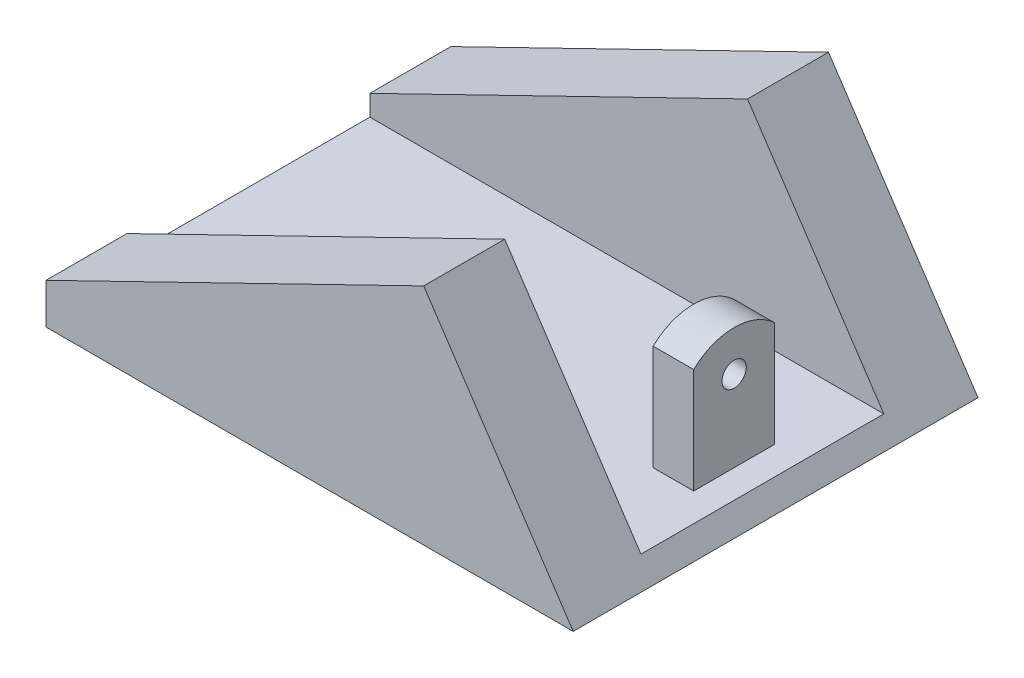
ISO-10303-21;
HEADER;
FILE_DESCRIPTION(('STEP AP214'),'2;1');
FILE_NAME('part.step','',(''),(''),'','','');
FILE_SCHEMA(('AUTOMOTIVE_DESIGN { 1 0 10303 214 1 1 1 1 }'));
ENDSEC;
DATA;
#1=APPLICATION_CONTEXT('core data for automotive mechanical design processes');
#2=APPLICATION_PROTOCOL_DEFINITION('international standard','automotive_design',2000,#1);
#3=PRODUCT_CONTEXT('',#1,'mechanical');
#4=PRODUCT('Part','Part','',(#3));
#5=PRODUCT_RELATED_PRODUCT_CATEGORY('part','',(#4));
#6=PRODUCT_DEFINITION_FORMATION('','',#4);
#7=PRODUCT_DEFINITION_CONTEXT('part definition',#1,'design');
#8=PRODUCT_DEFINITION('design','',#6,#7);
#9=PRODUCT_DEFINITION_SHAPE('','',#8);
#10=(LENGTH_UNIT() NAMED_UNIT(*) SI_UNIT(.MILLI.,.METRE.));
#11=(NAMED_UNIT(*) PLANE_ANGLE_UNIT() SI_UNIT($,.RADIAN.));
#12=(NAMED_UNIT(*) SI_UNIT($,.STERADIAN.) SOLID_ANGLE_UNIT());
#13=UNCERTAINTY_MEASURE_WITH_UNIT(LENGTH_MEASURE(1.E-05),#10,'distance_accuracy_value','');
#14=(GEOMETRIC_REPRESENTATION_CONTEXT(3) GLOBAL_UNCERTAINTY_ASSIGNED_CONTEXT((#13)) GLOBAL_UNIT_ASSIGNED_CONTEXT((#10,
#11,#12)) REPRESENTATION_CONTEXT('',''));
#15=CARTESIAN_POINT('',(0.,0.,0.));
#16=DIRECTION('',(0.,0.,1.));
#17=DIRECTION('',(1.,0.,0.));
#18=AXIS2_PLACEMENT_3D('',#15,#16,#17);
#19=CARTESIAN_POINT('',(0.,2.453,0.));
#20=DIRECTION('',(0.,-1.,0.));
#21=DIRECTION('',(0.,0.,-1.));
#22=AXIS2_PLACEMENT_3D('',#19,#20,#21);
#23=PLANE('',#22);
#24=CARTESIAN_POINT('',(46.106088109525,2.453,35.));
#25=DIRECTION('',(0.,1.,0.));
#26=DIRECTION('',(0.,0.,1.));
#27=AXIS2_PLACEMENT_3D('',#24,#25,#26);
#28=CIRCLE('',#27,1.575);
#29=CARTESIAN_POINT('',(46.106088109525,2.453,36.575));
#30=VERTEX_POINT('',#29);
#31=EDGE_CURVE('E321',#30,#30,#28,.T.);
#32=ORIENTED_EDGE('',*,*,#31,.F.);
#33=EDGE_LOOP('',(#32));
#34=FACE_BOUND('',#33,.T.);
#35=CARTESIAN_POINT('',(46.106088109525,2.453,13.));
#36=DIRECTION('',(0.,1.,0.));
#37=DIRECTION('',(0.,0.,1.));
#38=AXIS2_PLACEMENT_3D('',#35,#36,#37);
#39=CIRCLE('',#38,1.575);
#40=CARTESIAN_POINT('',(46.106088109525,2.453,14.575));
#41=VERTEX_POINT('',#40);
#42=EDGE_CURVE('E327',#41,#41,#39,.T.);
#43=ORIENTED_EDGE('',*,*,#42,.F.);
#44=EDGE_LOOP('',(#43));
#45=FACE_BOUND('',#44,.T.);
#46=DIRECTION('',(1.,0.,0.));
#47=VECTOR('',#46,1.);
#48=CARTESIAN_POINT('',(65.122,2.453,40.));
#49=LINE('',#48,#47);
#50=CARTESIAN_POINT('',(0.,2.453,40.));
#51=VERTEX_POINT('',#50);
#52=CARTESIAN_POINT('',(63.4881117763751,2.453,40.));
#53=VERTEX_POINT('',#52);
#54=EDGE_CURVE('E194',#51,#53,#49,.T.);
#55=ORIENTED_EDGE('',*,*,#54,.T.);
#56=DIRECTION('',(0.,0.,-1.));
#57=VECTOR('',#56,1.);
#58=CARTESIAN_POINT('',(63.4881117763751,2.453,0.));
#59=LINE('',#58,#57);
#60=CARTESIAN_POINT('',(63.4881117763751,2.453,10.));
#61=VERTEX_POINT('',#60);
#62=EDGE_CURVE('E164',#53,#61,#59,.T.);
#63=ORIENTED_EDGE('',*,*,#62,.T.);
#64=DIRECTION('',(-1.,0.,0.));
#65=VECTOR('',#64,1.);
#66=CARTESIAN_POINT('',(0.,2.453,10.));
#67=LINE('',#66,#65);
#68=CARTESIAN_POINT('',(0.,2.453,10.));
#69=VERTEX_POINT('',#68);
#70=EDGE_CURVE('E197',#61,#69,#67,.T.);
#71=ORIENTED_EDGE('',*,*,#70,.T.);
#72=DIRECTION('',(0.,0.,1.));
#73=VECTOR('',#72,1.);
#74=CARTESIAN_POINT('',(0.,2.453,40.));
#75=LINE('',#74,#73);
#76=EDGE_CURVE('E191',#69,#51,#75,.T.);
#77=ORIENTED_EDGE('',*,*,#76,.T.);
#78=EDGE_LOOP('',(#55,#63,#71,#77));
#79=FACE_BOUND('',#78,.T.);
#80=DIRECTION('',(-1.,0.,0.));
#81=VECTOR('',#80,1.);
#82=CARTESIAN_POINT('',(60.,2.453,20.));
#83=LINE('',#82,#81);
#84=CARTESIAN_POINT('',(60.,2.453,20.));
#85=VERTEX_POINT('',#84);
#86=CARTESIAN_POINT('',(55.,2.453,20.));
#87=VERTEX_POINT('',#86);
#88=EDGE_CURVE('E339',#85,#87,#83,.T.);
#89=ORIENTED_EDGE('',*,*,#88,.F.);
#90=DIRECTION('',(0.,0.,-1.));
#91=VECTOR('',#90,1.);
#92=CARTESIAN_POINT('',(60.,2.453,30.));
#93=LINE('',#92,#91);
#94=CARTESIAN_POINT('',(60.,2.453,30.));
#95=VERTEX_POINT('',#94);
#96=EDGE_CURVE('E149',#95,#85,#93,.T.);
#97=ORIENTED_EDGE('',*,*,#96,.F.);
#98=DIRECTION('',(1.,0.,0.));
#99=VECTOR('',#98,1.);
#100=CARTESIAN_POINT('',(55.,2.453,30.));
#101=LINE('',#100,#99);
#102=CARTESIAN_POINT('',(55.,2.453,30.));
#103=VERTEX_POINT('',#102);
#104=EDGE_CURVE('E154',#103,#95,#101,.T.);
#105=ORIENTED_EDGE('',*,*,#104,.F.);
#106=DIRECTION('',(0.,0.,1.));
#107=VECTOR('',#106,1.);
#108=CARTESIAN_POINT('',(55.,2.453,20.));
#109=LINE('',#108,#107);
#110=EDGE_CURVE('E341',#87,#103,#109,.T.);
#111=ORIENTED_EDGE('',*,*,#110,.F.);
#112=EDGE_LOOP('',(#89,#97,#105,#111));
#113=FACE_BOUND('',#112,.T.);
#114=ADVANCED_FACE('F42',(#34,#45,#79,#113),#23,.F.);
#115=CARTESIAN_POINT('',(65.122,0.,50.));
#116=DIRECTION('',(0.,1.,0.));
#117=DIRECTION('',(0.,0.,1.));
#118=AXIS2_PLACEMENT_3D('',#115,#116,#117);
#119=PLANE('',#118);
#120=CARTESIAN_POINT('',(46.106088109525,0.,35.));
#121=DIRECTION('',(0.,1.,0.));
#122=DIRECTION('',(0.,0.,1.));
#123=AXIS2_PLACEMENT_3D('',#120,#121,#122);
#124=CIRCLE('',#123,1.575);
#125=CARTESIAN_POINT('',(46.106088109525,0.,36.575));
#126=VERTEX_POINT('',#125);
#127=EDGE_CURVE('E319',#126,#126,#124,.T.);
#128=ORIENTED_EDGE('',*,*,#127,.T.);
#129=EDGE_LOOP('',(#128));
#130=FACE_BOUND('',#129,.T.);
#131=CARTESIAN_POINT('',(46.106088109525,0.,13.));
#132=DIRECTION('',(0.,1.,0.));
#133=DIRECTION('',(0.,0.,1.));
#134=AXIS2_PLACEMENT_3D('',#131,#132,#133);
#135=CIRCLE('',#134,1.575);
#136=CARTESIAN_POINT('',(46.106088109525,0.,14.575));
#137=VERTEX_POINT('',#136);
#138=EDGE_CURVE('E322',#137,#137,#135,.T.);
#139=ORIENTED_EDGE('',*,*,#138,.T.);
#140=EDGE_LOOP('',(#139));
#141=FACE_BOUND('',#140,.T.);
#142=DIRECTION('',(1.,0.,0.));
#143=VECTOR('',#142,1.);
#144=CARTESIAN_POINT('',(65.122,0.,0.));
#145=LINE('',#144,#143);
#146=CARTESIAN_POINT('',(0.,0.,0.));
#147=VERTEX_POINT('',#146);
#148=CARTESIAN_POINT('',(65.122,0.,0.));
#149=VERTEX_POINT('',#148);
#150=EDGE_CURVE('E203',#147,#149,#145,.T.);
#151=ORIENTED_EDGE('',*,*,#150,.T.);
#152=DIRECTION('',(0.,0.,-1.));
#153=VECTOR('',#152,1.);
#154=CARTESIAN_POINT('',(65.122,0.,50.));
#155=LINE('',#154,#153);
#156=CARTESIAN_POINT('',(65.122,0.,50.));
#157=VERTEX_POINT('',#156);
#158=EDGE_CURVE('E50',#157,#149,#155,.T.);
#159=ORIENTED_EDGE('',*,*,#158,.F.);
#160=DIRECTION('',(1.,0.,0.));
#161=VECTOR('',#160,1.);
#162=CARTESIAN_POINT('',(65.122,0.,50.));
#163=LINE('',#162,#161);
#164=CARTESIAN_POINT('',(0.,0.,50.));
#165=VERTEX_POINT('',#164);
#166=EDGE_CURVE('E206',#165,#157,#163,.T.);
#167=ORIENTED_EDGE('',*,*,#166,.F.);
#168=DIRECTION('',(0.,0.,-1.));
#169=VECTOR('',#168,1.);
#170=CARTESIAN_POINT('',(0.,0.,50.));
#171=LINE('',#170,#169);
#172=EDGE_CURVE('E213',#165,#147,#171,.T.);
#173=ORIENTED_EDGE('',*,*,#172,.T.);
#174=EDGE_LOOP('',(#151,#159,#167,#173));
#175=FACE_BOUND('',#174,.T.);
#176=ADVANCED_FACE('F44',(#130,#141,#175),#119,.F.);
#177=CARTESIAN_POINT('',(0.,0.,50.));
#178=DIRECTION('',(1.,0.,0.));
#179=DIRECTION('',(0.,0.,-1.));
#180=AXIS2_PLACEMENT_3D('',#177,#178,#179);
#181=PLANE('',#180);
#182=DIRECTION('',(0.,-1.,0.));
#183=VECTOR('',#182,1.);
#184=CARTESIAN_POINT('',(0.,0.,50.));
#185=LINE('',#184,#183);
#186=CARTESIAN_POINT('',(0.,5.,50.));
#187=VERTEX_POINT('',#186);
#188=EDGE_CURVE('E209',#187,#165,#185,.T.);
#189=ORIENTED_EDGE('',*,*,#188,.F.);
#190=DIRECTION('',(0.,0.,1.));
#191=VECTOR('',#190,1.);
#192=CARTESIAN_POINT('',(0.,5.,0.));
#193=LINE('',#192,#191);
#194=CARTESIAN_POINT('',(0.,5.,40.));
#195=VERTEX_POINT('',#194);
#196=EDGE_CURVE('E179',#195,#187,#193,.T.);
#197=ORIENTED_EDGE('',*,*,#196,.F.);
#198=DIRECTION('',(0.,1.,0.));
#199=VECTOR('',#198,1.);
#200=CARTESIAN_POINT('',(0.,2.453,40.));
#201=LINE('',#200,#199);
#202=EDGE_CURVE('E199',#51,#195,#201,.T.);
#203=ORIENTED_EDGE('',*,*,#202,.F.);
#204=ORIENTED_EDGE('',*,*,#76,.F.);
#205=DIRECTION('',(0.,1.,0.));
#206=VECTOR('',#205,1.);
#207=CARTESIAN_POINT('',(0.,2.453,10.));
#208=LINE('',#207,#206);
#209=CARTESIAN_POINT('',(0.,5.,10.));
#210=VERTEX_POINT('',#209);
#211=EDGE_CURVE('E200',#69,#210,#208,.T.);
#212=ORIENTED_EDGE('',*,*,#211,.T.);
#213=CARTESIAN_POINT('',(0.,5.,0.));
#214=VERTEX_POINT('',#213);
#215=EDGE_CURVE('E187',#214,#210,#193,.T.);
#216=ORIENTED_EDGE('',*,*,#215,.F.);
#217=DIRECTION('',(0.,-1.,0.));
#218=VECTOR('',#217,1.);
#219=CARTESIAN_POINT('',(0.,0.,0.));
#220=LINE('',#219,#218);
#221=EDGE_CURVE('E210',#214,#147,#220,.T.);
#222=ORIENTED_EDGE('',*,*,#221,.T.);
#223=ORIENTED_EDGE('',*,*,#172,.F.);
#224=EDGE_LOOP('',(#189,#197,#203,#204,#212,#216,#222,#223));
#225=FACE_BOUND('',#224,.T.);
#226=ADVANCED_FACE('F232',(#225),#181,.F.);
#227=CARTESIAN_POINT('',(0.,0.,50.));
#228=DIRECTION('',(0.,0.,-1.));
#229=DIRECTION('',(-1.,0.,0.));
#230=AXIS2_PLACEMENT_3D('',#227,#228,#229);
#231=PLANE('',#230);
#232=ORIENTED_EDGE('',*,*,#166,.T.);
#233=DIRECTION('',(0.554360704552613,-0.832276522105442,0.));
#234=VECTOR('',#233,1.);
#235=CARTESIAN_POINT('',(46.655,27.725,50.));
#236=LINE('',#235,#234);
#237=CARTESIAN_POINT('',(46.655,27.725,50.));
#238=VERTEX_POINT('',#237);
#239=EDGE_CURVE('E160',#238,#157,#236,.T.);
#240=ORIENTED_EDGE('',*,*,#239,.F.);
#241=DIRECTION('',(0.899022937895252,0.437901538177465,0.));
#242=VECTOR('',#241,1.);
#243=CARTESIAN_POINT('',(-1.96841763680577,4.04121121430905,50.));
#244=LINE('',#243,#242);
#245=EDGE_CURVE('E175',#187,#238,#244,.T.);
#246=ORIENTED_EDGE('',*,*,#245,.F.);
#247=ORIENTED_EDGE('',*,*,#188,.T.);
#248=EDGE_LOOP('',(#232,#240,#246,#247));
#249=FACE_BOUND('',#248,.T.);
#250=ADVANCED_FACE('F253',(#249),#231,.F.);
#251=CARTESIAN_POINT('',(0.,0.,0.));
#252=DIRECTION('',(0.,0.,-1.));
#253=DIRECTION('',(-1.,0.,0.));
#254=AXIS2_PLACEMENT_3D('',#251,#252,#253);
#255=PLANE('',#254);
#256=DIRECTION('',(0.554360704552613,-0.832276522105442,0.));
#257=VECTOR('',#256,1.);
#258=CARTESIAN_POINT('',(46.655,27.725,0.));
#259=LINE('',#258,#257);
#260=CARTESIAN_POINT('',(46.655,27.725,0.));
#261=VERTEX_POINT('',#260);
#262=EDGE_CURVE('E161',#261,#149,#259,.T.);
#263=ORIENTED_EDGE('',*,*,#262,.T.);
#264=ORIENTED_EDGE('',*,*,#150,.F.);
#265=ORIENTED_EDGE('',*,*,#221,.F.);
#266=DIRECTION('',(0.899022937895252,0.437901538177465,0.));
#267=VECTOR('',#266,1.);
#268=CARTESIAN_POINT('',(-1.96841763680577,4.04121121430905,0.));
#269=LINE('',#268,#267);
#270=EDGE_CURVE('E176',#214,#261,#269,.T.);
#271=ORIENTED_EDGE('',*,*,#270,.T.);
#272=EDGE_LOOP('',(#263,#264,#265,#271));
#273=FACE_BOUND('',#272,.T.);
#274=ADVANCED_FACE('F227',(#273),#255,.T.);
#275=CARTESIAN_POINT('',(0.,2.453,10.));
#276=DIRECTION('',(0.,0.,-1.));
#277=DIRECTION('',(-1.,0.,0.));
#278=AXIS2_PLACEMENT_3D('',#275,#276,#277);
#279=PLANE('',#278);
#280=ORIENTED_EDGE('',*,*,#70,.F.);
#281=DIRECTION('',(-0.554360704552613,0.832276522105442,0.));
#282=VECTOR('',#281,1.);
#283=CARTESIAN_POINT('',(43.9772125024626,31.7452338424879,10.));
#284=LINE('',#283,#282);
#285=CARTESIAN_POINT('',(46.655,27.725,10.));
#286=VERTEX_POINT('',#285);
#287=EDGE_CURVE('E171',#61,#286,#284,.T.);
#288=ORIENTED_EDGE('',*,*,#287,.T.);
#289=DIRECTION('',(-0.899022937895252,-0.437901538177465,0.));
#290=VECTOR('',#289,1.);
#291=CARTESIAN_POINT('',(-1.00271194418886,4.51159299256903,10.));
#292=LINE('',#291,#290);
#293=EDGE_CURVE('E185',#286,#210,#292,.T.);
#294=ORIENTED_EDGE('',*,*,#293,.T.);
#295=ORIENTED_EDGE('',*,*,#211,.F.);
#296=EDGE_LOOP('',(#280,#288,#294,#295));
#297=FACE_BOUND('',#296,.T.);
#298=ADVANCED_FACE('F242',(#297),#279,.F.);
#299=CARTESIAN_POINT('',(65.122,2.453,40.));
#300=DIRECTION('',(0.,0.,1.));
#301=DIRECTION('',(1.,0.,0.));
#302=AXIS2_PLACEMENT_3D('',#299,#300,#301);
#303=PLANE('',#302);
#304=DIRECTION('',(0.899022937895252,0.437901538177465,0.));
#305=VECTOR('',#304,1.);
#306=CARTESIAN_POINT('',(51.631639395458,30.1490516613821,40.));
#307=LINE('',#306,#305);
#308=CARTESIAN_POINT('',(46.655,27.725,40.));
#309=VERTEX_POINT('',#308);
#310=EDGE_CURVE('E11',#195,#309,#307,.T.);
#311=ORIENTED_EDGE('',*,*,#310,.T.);
#312=DIRECTION('',(0.554360704552613,-0.832276522105442,0.));
#313=VECTOR('',#312,1.);
#314=CARTESIAN_POINT('',(63.9902314278189,1.69915436528518,40.));
#315=LINE('',#314,#313);
#316=EDGE_CURVE('E168',#309,#53,#315,.T.);
#317=ORIENTED_EDGE('',*,*,#316,.T.);
#318=ORIENTED_EDGE('',*,*,#54,.F.);
#319=ORIENTED_EDGE('',*,*,#202,.T.);
#320=EDGE_LOOP('',(#311,#317,#318,#319));
#321=FACE_BOUND('',#320,.T.);
#322=ADVANCED_FACE('F247',(#321),#303,.F.);
#323=CARTESIAN_POINT('',(-1.96841763680577,4.04121121430905,0.));
#324=DIRECTION('',(0.437901538177465,-0.899022937895252,0.));
#325=DIRECTION('',(0.899022937895252,0.437901538177465,0.));
#326=AXIS2_PLACEMENT_3D('',#323,#324,#325);
#327=PLANE('',#326);
#328=ORIENTED_EDGE('',*,*,#196,.T.);
#329=ORIENTED_EDGE('',*,*,#245,.T.);
#330=DIRECTION('',(0.,0.,1.));
#331=VECTOR('',#330,1.);
#332=CARTESIAN_POINT('',(46.655,27.725,0.));
#333=LINE('',#332,#331);
#334=EDGE_CURVE('E186',#309,#238,#333,.T.);
#335=ORIENTED_EDGE('',*,*,#334,.F.);
#336=ORIENTED_EDGE('',*,*,#310,.F.);
#337=EDGE_LOOP('',(#328,#329,#335,#336));
#338=FACE_BOUND('',#337,.T.);
#339=ADVANCED_FACE('F250',(#338),#327,.F.);
#340=EDGE_CURVE('E183',#261,#286,#333,.T.);
#341=ORIENTED_EDGE('',*,*,#340,.F.);
#342=ORIENTED_EDGE('',*,*,#270,.F.);
#343=ORIENTED_EDGE('',*,*,#215,.T.);
#344=ORIENTED_EDGE('',*,*,#293,.F.);
#345=EDGE_LOOP('',(#341,#342,#343,#344));
#346=FACE_BOUND('',#345,.T.);
#347=ADVANCED_FACE('F239',(#346),#327,.F.);
#348=CARTESIAN_POINT('',(46.655,27.725,0.));
#349=DIRECTION('',(-0.832276522105442,-0.554360704552613,0.));
#350=DIRECTION('',(0.554360704552613,-0.832276522105442,0.));
#351=AXIS2_PLACEMENT_3D('',#348,#349,#350);
#352=PLANE('',#351);
#353=ORIENTED_EDGE('',*,*,#62,.F.);
#354=ORIENTED_EDGE('',*,*,#316,.F.);
#355=ORIENTED_EDGE('',*,*,#334,.T.);
#356=ORIENTED_EDGE('',*,*,#239,.T.);
#357=ORIENTED_EDGE('',*,*,#158,.T.);
#358=ORIENTED_EDGE('',*,*,#262,.F.);
#359=ORIENTED_EDGE('',*,*,#340,.T.);
#360=ORIENTED_EDGE('',*,*,#287,.F.);
#361=EDGE_LOOP('',(#353,#354,#355,#356,#357,#358,#359,#360));
#362=FACE_BOUND('',#361,.T.);
#363=ADVANCED_FACE('F220',(#362),#352,.F.);
#364=CARTESIAN_POINT('',(60.,17.453,20.));
#365=DIRECTION('',(0.,0.,1.));
#366=DIRECTION('',(1.,0.,0.));
#367=AXIS2_PLACEMENT_3D('',#364,#365,#366);
#368=PLANE('',#367);
#369=DIRECTION('',(0.,-1.,0.));
#370=VECTOR('',#369,1.);
#371=CARTESIAN_POINT('',(55.,17.453,20.));
#372=LINE('',#371,#370);
#373=CARTESIAN_POINT('',(55.,15.453,20.));
#374=VERTEX_POINT('',#373);
#375=EDGE_CURVE('E65',#374,#87,#372,.T.);
#376=ORIENTED_EDGE('',*,*,#375,.F.);
#377=DIRECTION('',(1.,0.,0.));
#378=VECTOR('',#377,1.);
#379=CARTESIAN_POINT('',(45.,15.453,20.));
#380=LINE('',#379,#378);
#381=CARTESIAN_POINT('',(60.,15.453,20.));
#382=VERTEX_POINT('',#381);
#383=EDGE_CURVE('E134',#374,#382,#380,.T.);
#384=ORIENTED_EDGE('',*,*,#383,.T.);
#385=DIRECTION('',(0.,-1.,0.));
#386=VECTOR('',#385,1.);
#387=CARTESIAN_POINT('',(60.,17.453,20.));
#388=LINE('',#387,#386);
#389=EDGE_CURVE('E143',#382,#85,#388,.T.);
#390=ORIENTED_EDGE('',*,*,#389,.T.);
#391=ORIENTED_EDGE('',*,*,#88,.T.);
#392=EDGE_LOOP('',(#376,#384,#390,#391));
#393=FACE_BOUND('',#392,.T.);
#394=ADVANCED_FACE('F141',(#393),#368,.F.);
#395=CARTESIAN_POINT('',(55.,17.453,20.));
#396=DIRECTION('',(1.,0.,0.));
#397=DIRECTION('',(0.,0.,-1.));
#398=AXIS2_PLACEMENT_3D('',#395,#396,#397);
#399=PLANE('',#398);
#400=CARTESIAN_POINT('',(55.,12.453,25.));
#401=DIRECTION('',(1.,0.,0.));
#402=DIRECTION('',(0.,0.,-1.));
#403=AXIS2_PLACEMENT_3D('',#400,#401,#402);
#404=CIRCLE('',#403,1.5);
#405=CARTESIAN_POINT('',(55.,12.453,23.5));
#406=VERTEX_POINT('',#405);
#407=EDGE_CURVE('E138',#406,#406,#404,.T.);
#408=ORIENTED_EDGE('',*,*,#407,.T.);
#409=EDGE_LOOP('',(#408));
#410=FACE_BOUND('',#409,.T.);
#411=DIRECTION('',(0.,-1.,0.));
#412=VECTOR('',#411,1.);
#413=CARTESIAN_POINT('',(55.,17.453,30.));
#414=LINE('',#413,#412);
#415=CARTESIAN_POINT('',(55.,15.453,30.));
#416=VERTEX_POINT('',#415);
#417=EDGE_CURVE('E152',#416,#103,#414,.T.);
#418=ORIENTED_EDGE('',*,*,#417,.F.);
#419=CARTESIAN_POINT('',(55.,10.203,25.));
#420=DIRECTION('',(1.,0.,0.));
#421=DIRECTION('',(0.,0.,-1.));
#422=AXIS2_PLACEMENT_3D('',#419,#420,#421);
#423=CIRCLE('',#422,7.25);
#424=EDGE_CURVE('E336',#416,#374,#423,.F.);
#425=ORIENTED_EDGE('',*,*,#424,.T.);
#426=ORIENTED_EDGE('',*,*,#375,.T.);
#427=ORIENTED_EDGE('',*,*,#110,.T.);
#428=EDGE_LOOP('',(#418,#425,#426,#427));
#429=FACE_BOUND('',#428,.T.);
#430=ADVANCED_FACE('F288',(#410,#429),#399,.F.);
#431=CARTESIAN_POINT('',(55.,17.453,30.));
#432=DIRECTION('',(0.,0.,-1.));
#433=DIRECTION('',(-1.,0.,0.));
#434=AXIS2_PLACEMENT_3D('',#431,#432,#433);
#435=PLANE('',#434);
#436=DIRECTION('',(0.,-1.,0.));
#437=VECTOR('',#436,1.);
#438=CARTESIAN_POINT('',(60.,17.453,30.));
#439=LINE('',#438,#437);
#440=CARTESIAN_POINT('',(60.,15.453,30.));
#441=VERTEX_POINT('',#440);
#442=EDGE_CURVE('E150',#441,#95,#439,.T.);
#443=ORIENTED_EDGE('',*,*,#442,.F.);
#444=DIRECTION('',(1.,0.,0.));
#445=VECTOR('',#444,1.);
#446=CARTESIAN_POINT('',(45.,15.453,30.));
#447=LINE('',#446,#445);
#448=EDGE_CURVE('E136',#416,#441,#447,.T.);
#449=ORIENTED_EDGE('',*,*,#448,.F.);
#450=ORIENTED_EDGE('',*,*,#417,.T.);
#451=ORIENTED_EDGE('',*,*,#104,.T.);
#452=EDGE_LOOP('',(#443,#449,#450,#451));
#453=FACE_BOUND('',#452,.T.);
#454=ADVANCED_FACE('F293',(#453),#435,.F.);
#455=CARTESIAN_POINT('',(60.,17.453,30.));
#456=DIRECTION('',(-1.,0.,0.));
#457=DIRECTION('',(0.,0.,1.));
#458=AXIS2_PLACEMENT_3D('',#455,#456,#457);
#459=PLANE('',#458);
#460=CARTESIAN_POINT('',(60.,12.453,25.));
#461=DIRECTION('',(1.,0.,0.));
#462=DIRECTION('',(0.,0.,-1.));
#463=AXIS2_PLACEMENT_3D('',#460,#461,#462);
#464=CIRCLE('',#463,1.5);
#465=CARTESIAN_POINT('',(60.,12.453,23.5));
#466=VERTEX_POINT('',#465);
#467=EDGE_CURVE('E324',#466,#466,#464,.T.);
#468=ORIENTED_EDGE('',*,*,#467,.F.);
#469=EDGE_LOOP('',(#468));
#470=FACE_BOUND('',#469,.T.);
#471=ORIENTED_EDGE('',*,*,#389,.F.);
#472=CARTESIAN_POINT('',(60.,10.203,25.));
#473=DIRECTION('',(-1.,0.,0.));
#474=DIRECTION('',(0.,0.,1.));
#475=AXIS2_PLACEMENT_3D('',#472,#473,#474);
#476=CIRCLE('',#475,7.25);
#477=EDGE_CURVE('E57',#441,#382,#476,.T.);
#478=ORIENTED_EDGE('',*,*,#477,.F.);
#479=ORIENTED_EDGE('',*,*,#442,.T.);
#480=ORIENTED_EDGE('',*,*,#96,.T.);
#481=EDGE_LOOP('',(#471,#478,#479,#480));
#482=FACE_BOUND('',#481,.T.);
#483=ADVANCED_FACE('F147',(#470,#482),#459,.F.);
#484=CARTESIAN_POINT('',(45.,10.203,25.));
#485=DIRECTION('',(1.,0.,0.));
#486=DIRECTION('',(0.,0.,-1.));
#487=AXIS2_PLACEMENT_3D('',#484,#485,#486);
#488=CYLINDRICAL_SURFACE('',#487,7.25);
#489=ORIENTED_EDGE('',*,*,#448,.T.);
#490=ORIENTED_EDGE('',*,*,#477,.T.);
#491=ORIENTED_EDGE('',*,*,#383,.F.);
#492=ORIENTED_EDGE('',*,*,#424,.F.);
#493=EDGE_LOOP('',(#489,#490,#491,#492));
#494=FACE_BOUND('',#493,.T.);
#495=ADVANCED_FACE('F133',(#494),#488,.T.);
#496=CARTESIAN_POINT('',(0.,12.453,25.));
#497=DIRECTION('',(1.,0.,0.));
#498=DIRECTION('',(0.,0.,-1.));
#499=AXIS2_PLACEMENT_3D('',#496,#497,#498);
#500=CYLINDRICAL_SURFACE('',#499,1.5);
#501=ORIENTED_EDGE('',*,*,#467,.T.);
#502=EDGE_LOOP('',(#501));
#503=FACE_BOUND('',#502,.T.);
#504=ORIENTED_EDGE('',*,*,#407,.F.);
#505=EDGE_LOOP('',(#504));
#506=FACE_BOUND('',#505,.T.);
#507=ADVANCED_FACE('F303',(#503,#506),#500,.F.);
#508=CARTESIAN_POINT('',(46.106088109525,0.,13.));
#509=DIRECTION('',(0.,1.,0.));
#510=DIRECTION('',(0.,0.,1.));
#511=AXIS2_PLACEMENT_3D('',#508,#509,#510);
#512=CYLINDRICAL_SURFACE('',#511,1.575);
#513=ORIENTED_EDGE('',*,*,#138,.F.);
#514=EDGE_LOOP('',(#513));
#515=FACE_BOUND('',#514,.T.);
#516=ORIENTED_EDGE('',*,*,#42,.T.);
#517=EDGE_LOOP('',(#516));
#518=FACE_BOUND('',#517,.T.);
#519=ADVANCED_FACE('F306',(#515,#518),#512,.F.);
#520=CARTESIAN_POINT('',(46.106088109525,0.,35.));
#521=DIRECTION('',(0.,1.,0.));
#522=DIRECTION('',(0.,0.,1.));
#523=AXIS2_PLACEMENT_3D('',#520,#521,#522);
#524=CYLINDRICAL_SURFACE('',#523,1.575);
#525=ORIENTED_EDGE('',*,*,#127,.F.);
#526=EDGE_LOOP('',(#525));
#527=FACE_BOUND('',#526,.T.);
#528=ORIENTED_EDGE('',*,*,#31,.T.);
#529=EDGE_LOOP('',(#528));
#530=FACE_BOUND('',#529,.T.);
#531=ADVANCED_FACE('F310',(#527,#530),#524,.F.);
#532=CLOSED_SHELL('',(#114,#176,#226,#250,#274,#298,#322,#339,#347,#363,#394,#430,#454,#483,
#495,#507,#519,#531));
#533=MANIFOLD_SOLID_BREP('B2',#532);
#534=ADVANCED_BREP_SHAPE_REPRESENTATION('',(#18,#533),#14);
#535=SHAPE_DEFINITION_REPRESENTATION(#9,#534);
ENDSEC;
END-ISO-10303-21;
